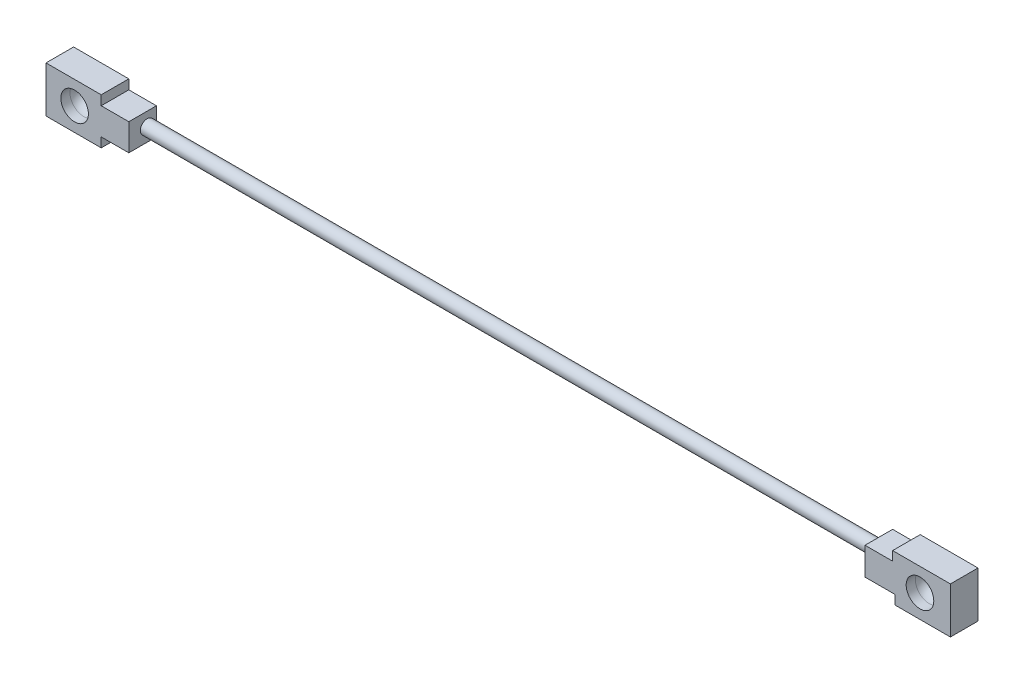
ISO-10303-21;
HEADER;
FILE_DESCRIPTION(('STEP AP214'),'2;1');
FILE_NAME('part.step','',(''),(''),'','','');
FILE_SCHEMA(('AUTOMOTIVE_DESIGN { 1 0 10303 214 1 1 1 1 }'));
ENDSEC;
DATA;
#1=APPLICATION_CONTEXT('core data for automotive mechanical design processes');
#2=APPLICATION_PROTOCOL_DEFINITION('international standard','automotive_design',2000,#1);
#3=PRODUCT_CONTEXT('',#1,'mechanical');
#4=PRODUCT('Part','Part','',(#3));
#5=PRODUCT_RELATED_PRODUCT_CATEGORY('part','',(#4));
#6=PRODUCT_DEFINITION_FORMATION('','',#4);
#7=PRODUCT_DEFINITION_CONTEXT('part definition',#1,'design');
#8=PRODUCT_DEFINITION('design','',#6,#7);
#9=PRODUCT_DEFINITION_SHAPE('','',#8);
#10=(LENGTH_UNIT() NAMED_UNIT(*) SI_UNIT(.MILLI.,.METRE.));
#11=(NAMED_UNIT(*) PLANE_ANGLE_UNIT() SI_UNIT($,.RADIAN.));
#12=(NAMED_UNIT(*) SI_UNIT($,.STERADIAN.) SOLID_ANGLE_UNIT());
#13=UNCERTAINTY_MEASURE_WITH_UNIT(LENGTH_MEASURE(1.E-05),#10,'distance_accuracy_value','');
#14=(GEOMETRIC_REPRESENTATION_CONTEXT(3) GLOBAL_UNCERTAINTY_ASSIGNED_CONTEXT((#13)) GLOBAL_UNIT_ASSIGNED_CONTEXT((#10,
#11,#12)) REPRESENTATION_CONTEXT('',''));
#15=CARTESIAN_POINT('',(0.,0.,0.));
#16=DIRECTION('',(0.,0.,1.));
#17=DIRECTION('',(1.,0.,0.));
#18=AXIS2_PLACEMENT_3D('',#15,#16,#17);
#19=CARTESIAN_POINT('',(5.89320478213972,1.46443640447974,3.));
#20=DIRECTION('',(-1.,0.,0.));
#21=DIRECTION('',(0.,0.,1.));
#22=AXIS2_PLACEMENT_3D('',#19,#20,#21);
#23=PLANE('',#22);
#24=DIRECTION('',(0.,1.,0.));
#25=VECTOR('',#24,1.);
#26=CARTESIAN_POINT('',(5.89320478213972,1.46443640447974,0.));
#27=LINE('',#26,#25);
#28=CARTESIAN_POINT('',(5.89320478213972,-1.46443640447974,0.));
#29=VERTEX_POINT('',#28);
#30=CARTESIAN_POINT('',(5.89320478213972,1.46443640447974,0.));
#31=VERTEX_POINT('',#30);
#32=EDGE_CURVE('E126',#29,#31,#27,.T.);
#33=ORIENTED_EDGE('',*,*,#32,.T.);
#34=DIRECTION('',(0.,0.,-1.));
#35=VECTOR('',#34,1.);
#36=CARTESIAN_POINT('',(5.89320478213972,1.46443640447974,3.));
#37=LINE('',#36,#35);
#38=CARTESIAN_POINT('',(5.89320478213972,1.46443640447974,3.));
#39=VERTEX_POINT('',#38);
#40=EDGE_CURVE('E123',#39,#31,#37,.T.);
#41=ORIENTED_EDGE('',*,*,#40,.F.);
#42=DIRECTION('',(0.,1.,0.));
#43=VECTOR('',#42,1.);
#44=CARTESIAN_POINT('',(5.89320478213972,1.46443640447974,3.));
#45=LINE('',#44,#43);
#46=CARTESIAN_POINT('',(5.89320478213972,-1.46443640447974,3.));
#47=VERTEX_POINT('',#46);
#48=EDGE_CURVE('E112',#47,#39,#45,.T.);
#49=ORIENTED_EDGE('',*,*,#48,.F.);
#50=DIRECTION('',(0.,0.,-1.));
#51=VECTOR('',#50,1.);
#52=CARTESIAN_POINT('',(5.89320478213972,-1.46443640447974,3.));
#53=LINE('',#52,#51);
#54=EDGE_CURVE('E127',#47,#29,#53,.T.);
#55=ORIENTED_EDGE('',*,*,#54,.T.);
#56=EDGE_LOOP('',(#33,#41,#49,#55));
#57=FACE_BOUND('',#56,.T.);
#58=CARTESIAN_POINT('',(5.89320478213971,0.,1.00000000000239));
#59=DIRECTION('',(-1.,0.,0.));
#60=DIRECTION('',(0.,0.,1.));
#61=AXIS2_PLACEMENT_3D('',#58,#59,#60);
#62=CIRCLE('',#61,0.75);
#63=CARTESIAN_POINT('',(5.89320478213971,0.,1.75000000000239));
#64=VERTEX_POINT('',#63);
#65=EDGE_CURVE('E11',#64,#64,#62,.F.);
#66=ORIENTED_EDGE('',*,*,#65,.F.);
#67=EDGE_LOOP('',(#66));
#68=FACE_BOUND('',#67,.T.);
#69=ADVANCED_FACE('F34',(#57,#68),#23,.F.);
#70=CARTESIAN_POINT('',(-3.10679521786028,2.5,3.));
#71=DIRECTION('',(0.,-1.,0.));
#72=DIRECTION('',(0.,0.,-1.));
#73=AXIS2_PLACEMENT_3D('',#70,#71,#72);
#74=PLANE('',#73);
#75=DIRECTION('',(-1.,0.,0.));
#76=VECTOR('',#75,1.);
#77=CARTESIAN_POINT('',(-3.10679521786028,2.5,0.));
#78=LINE('',#77,#76);
#79=CARTESIAN_POINT('',(2.89320478213972,2.5,0.));
#80=VERTEX_POINT('',#79);
#81=CARTESIAN_POINT('',(-3.10679521786028,2.5,0.));
#82=VERTEX_POINT('',#81);
#83=EDGE_CURVE('E136',#80,#82,#78,.T.);
#84=ORIENTED_EDGE('',*,*,#83,.T.);
#85=DIRECTION('',(0.,0.,-1.));
#86=VECTOR('',#85,1.);
#87=CARTESIAN_POINT('',(-3.10679521786028,2.5,3.));
#88=LINE('',#87,#86);
#89=CARTESIAN_POINT('',(-3.10679521786028,2.5,3.));
#90=VERTEX_POINT('',#89);
#91=EDGE_CURVE('E43',#90,#82,#88,.T.);
#92=ORIENTED_EDGE('',*,*,#91,.F.);
#93=DIRECTION('',(-1.,0.,0.));
#94=VECTOR('',#93,1.);
#95=CARTESIAN_POINT('',(-3.10679521786028,2.5,3.));
#96=LINE('',#95,#94);
#97=CARTESIAN_POINT('',(2.89320478213972,2.5,3.));
#98=VERTEX_POINT('',#97);
#99=EDGE_CURVE('E151',#98,#90,#96,.T.);
#100=ORIENTED_EDGE('',*,*,#99,.F.);
#101=DIRECTION('',(0.,0.,-1.));
#102=VECTOR('',#101,1.);
#103=CARTESIAN_POINT('',(2.89320478213972,2.5,3.));
#104=LINE('',#103,#102);
#105=EDGE_CURVE('E132',#98,#80,#104,.T.);
#106=ORIENTED_EDGE('',*,*,#105,.T.);
#107=EDGE_LOOP('',(#84,#92,#100,#106));
#108=FACE_BOUND('',#107,.T.);
#109=ADVANCED_FACE('F36',(#108),#74,.F.);
#110=CARTESIAN_POINT('',(-3.10679521786028,-2.5,3.));
#111=DIRECTION('',(1.,0.,0.));
#112=DIRECTION('',(0.,0.,-1.));
#113=AXIS2_PLACEMENT_3D('',#110,#111,#112);
#114=PLANE('',#113);
#115=DIRECTION('',(0.,-1.,0.));
#116=VECTOR('',#115,1.);
#117=CARTESIAN_POINT('',(-3.10679521786028,-2.5,0.));
#118=LINE('',#117,#116);
#119=CARTESIAN_POINT('',(-3.10679521786028,-2.5,0.));
#120=VERTEX_POINT('',#119);
#121=EDGE_CURVE('E139',#82,#120,#118,.T.);
#122=ORIENTED_EDGE('',*,*,#121,.T.);
#123=DIRECTION('',(0.,0.,-1.));
#124=VECTOR('',#123,1.);
#125=CARTESIAN_POINT('',(-3.10679521786028,-2.5,3.));
#126=LINE('',#125,#124);
#127=CARTESIAN_POINT('',(-3.10679521786028,-2.5,3.));
#128=VERTEX_POINT('',#127);
#129=EDGE_CURVE('E161',#128,#120,#126,.T.);
#130=ORIENTED_EDGE('',*,*,#129,.F.);
#131=DIRECTION('',(0.,-1.,0.));
#132=VECTOR('',#131,1.);
#133=CARTESIAN_POINT('',(-3.10679521786028,-2.5,3.));
#134=LINE('',#133,#132);
#135=EDGE_CURVE('E96',#90,#128,#134,.T.);
#136=ORIENTED_EDGE('',*,*,#135,.F.);
#137=ORIENTED_EDGE('',*,*,#91,.T.);
#138=EDGE_LOOP('',(#122,#130,#136,#137));
#139=FACE_BOUND('',#138,.T.);
#140=ADVANCED_FACE('F164',(#139),#114,.F.);
#141=CARTESIAN_POINT('',(-3.10679521786028,-2.5,3.));
#142=DIRECTION('',(0.,1.,0.));
#143=DIRECTION('',(0.,0.,1.));
#144=AXIS2_PLACEMENT_3D('',#141,#142,#143);
#145=PLANE('',#144);
#146=DIRECTION('',(1.,0.,0.));
#147=VECTOR('',#146,1.);
#148=CARTESIAN_POINT('',(-3.10679521786028,-2.5,0.));
#149=LINE('',#148,#147);
#150=CARTESIAN_POINT('',(2.89320478213972,-2.5,0.));
#151=VERTEX_POINT('',#150);
#152=EDGE_CURVE('E142',#120,#151,#149,.T.);
#153=ORIENTED_EDGE('',*,*,#152,.T.);
#154=DIRECTION('',(0.,0.,-1.));
#155=VECTOR('',#154,1.);
#156=CARTESIAN_POINT('',(2.89320478213972,-2.5,3.));
#157=LINE('',#156,#155);
#158=CARTESIAN_POINT('',(2.89320478213972,-2.5,3.));
#159=VERTEX_POINT('',#158);
#160=EDGE_CURVE('E158',#159,#151,#157,.T.);
#161=ORIENTED_EDGE('',*,*,#160,.F.);
#162=DIRECTION('',(1.,0.,0.));
#163=VECTOR('',#162,1.);
#164=CARTESIAN_POINT('',(-3.10679521786028,-2.5,3.));
#165=LINE('',#164,#163);
#166=EDGE_CURVE('E182',#128,#159,#165,.T.);
#167=ORIENTED_EDGE('',*,*,#166,.F.);
#168=ORIENTED_EDGE('',*,*,#129,.T.);
#169=EDGE_LOOP('',(#153,#161,#167,#168));
#170=FACE_BOUND('',#169,.T.);
#171=ADVANCED_FACE('F175',(#170),#145,.F.);
#172=CARTESIAN_POINT('',(2.89320478213972,-2.5,3.));
#173=DIRECTION('',(-1.,0.,0.));
#174=DIRECTION('',(0.,-1.,0.));
#175=AXIS2_PLACEMENT_3D('',#172,#173,#174);
#176=PLANE('',#175);
#177=DIRECTION('',(0.,1.,0.));
#178=VECTOR('',#177,1.);
#179=CARTESIAN_POINT('',(2.89320478213972,-2.5,0.));
#180=LINE('',#179,#178);
#181=CARTESIAN_POINT('',(2.89320478213972,-1.46443640447974,0.));
#182=VERTEX_POINT('',#181);
#183=EDGE_CURVE('E144',#151,#182,#180,.T.);
#184=ORIENTED_EDGE('',*,*,#183,.T.);
#185=DIRECTION('',(0.,0.,-1.));
#186=VECTOR('',#185,1.);
#187=CARTESIAN_POINT('',(2.89320478213972,-1.46443640447974,3.));
#188=LINE('',#187,#186);
#189=CARTESIAN_POINT('',(2.89320478213972,-1.46443640447974,3.));
#190=VERTEX_POINT('',#189);
#191=EDGE_CURVE('E155',#190,#182,#188,.T.);
#192=ORIENTED_EDGE('',*,*,#191,.F.);
#193=DIRECTION('',(0.,1.,0.));
#194=VECTOR('',#193,1.);
#195=CARTESIAN_POINT('',(2.89320478213972,-2.5,3.));
#196=LINE('',#195,#194);
#197=EDGE_CURVE('E181',#159,#190,#196,.T.);
#198=ORIENTED_EDGE('',*,*,#197,.F.);
#199=ORIENTED_EDGE('',*,*,#160,.T.);
#200=EDGE_LOOP('',(#184,#192,#198,#199));
#201=FACE_BOUND('',#200,.T.);
#202=ADVANCED_FACE('F179',(#201),#176,.F.);
#203=CARTESIAN_POINT('',(2.89320478213972,-1.46443640447974,3.));
#204=DIRECTION('',(0.,1.,0.));
#205=DIRECTION('',(0.,0.,1.));
#206=AXIS2_PLACEMENT_3D('',#203,#204,#205);
#207=PLANE('',#206);
#208=DIRECTION('',(1.,0.,0.));
#209=VECTOR('',#208,1.);
#210=CARTESIAN_POINT('',(2.89320478213972,-1.46443640447974,0.));
#211=LINE('',#210,#209);
#212=EDGE_CURVE('E146',#182,#29,#211,.T.);
#213=ORIENTED_EDGE('',*,*,#212,.T.);
#214=ORIENTED_EDGE('',*,*,#54,.F.);
#215=DIRECTION('',(1.,0.,0.));
#216=VECTOR('',#215,1.);
#217=CARTESIAN_POINT('',(2.89320478213972,-1.46443640447974,3.));
#218=LINE('',#217,#216);
#219=EDGE_CURVE('E118',#190,#47,#218,.T.);
#220=ORIENTED_EDGE('',*,*,#219,.F.);
#221=ORIENTED_EDGE('',*,*,#191,.T.);
#222=EDGE_LOOP('',(#213,#214,#220,#221));
#223=FACE_BOUND('',#222,.T.);
#224=ADVANCED_FACE('F300',(#223),#207,.F.);
#225=CARTESIAN_POINT('',(2.89320478213972,1.46443640447974,3.));
#226=DIRECTION('',(0.,-1.,0.));
#227=DIRECTION('',(0.,0.,-1.));
#228=AXIS2_PLACEMENT_3D('',#225,#226,#227);
#229=PLANE('',#228);
#230=DIRECTION('',(-1.,0.,0.));
#231=VECTOR('',#230,1.);
#232=CARTESIAN_POINT('',(2.89320478213972,1.46443640447974,0.));
#233=LINE('',#232,#231);
#234=CARTESIAN_POINT('',(2.89320478213972,1.46443640447974,0.));
#235=VERTEX_POINT('',#234);
#236=EDGE_CURVE('E81',#31,#235,#233,.T.);
#237=ORIENTED_EDGE('',*,*,#236,.T.);
#238=DIRECTION('',(0.,0.,-1.));
#239=VECTOR('',#238,1.);
#240=CARTESIAN_POINT('',(2.89320478213972,1.46443640447974,3.));
#241=LINE('',#240,#239);
#242=CARTESIAN_POINT('',(2.89320478213972,1.46443640447974,3.));
#243=VERTEX_POINT('',#242);
#244=EDGE_CURVE('E128',#243,#235,#241,.T.);
#245=ORIENTED_EDGE('',*,*,#244,.F.);
#246=DIRECTION('',(-1.,0.,0.));
#247=VECTOR('',#246,1.);
#248=CARTESIAN_POINT('',(2.89320478213972,1.46443640447974,3.));
#249=LINE('',#248,#247);
#250=EDGE_CURVE('E116',#39,#243,#249,.T.);
#251=ORIENTED_EDGE('',*,*,#250,.F.);
#252=ORIENTED_EDGE('',*,*,#40,.T.);
#253=EDGE_LOOP('',(#237,#245,#251,#252));
#254=FACE_BOUND('',#253,.T.);
#255=ADVANCED_FACE('F130',(#254),#229,.F.);
#256=CARTESIAN_POINT('',(2.89320478213972,2.5,3.));
#257=DIRECTION('',(-1.,0.,0.));
#258=DIRECTION('',(0.,-1.,0.));
#259=AXIS2_PLACEMENT_3D('',#256,#257,#258);
#260=PLANE('',#259);
#261=DIRECTION('',(0.,1.,0.));
#262=VECTOR('',#261,1.);
#263=CARTESIAN_POINT('',(2.89320478213972,2.5,0.));
#264=LINE('',#263,#262);
#265=EDGE_CURVE('E87',#235,#80,#264,.T.);
#266=ORIENTED_EDGE('',*,*,#265,.T.);
#267=ORIENTED_EDGE('',*,*,#105,.F.);
#268=DIRECTION('',(0.,1.,0.));
#269=VECTOR('',#268,1.);
#270=CARTESIAN_POINT('',(2.89320478213972,2.5,3.));
#271=LINE('',#270,#269);
#272=EDGE_CURVE('E51',#243,#98,#271,.T.);
#273=ORIENTED_EDGE('',*,*,#272,.F.);
#274=ORIENTED_EDGE('',*,*,#244,.T.);
#275=EDGE_LOOP('',(#266,#267,#273,#274));
#276=FACE_BOUND('',#275,.T.);
#277=ADVANCED_FACE('F285',(#276),#260,.F.);
#278=CARTESIAN_POINT('',(2.89320478213972,2.5,3.));
#279=DIRECTION('',(0.,0.,-1.));
#280=DIRECTION('',(-1.,0.,0.));
#281=AXIS2_PLACEMENT_3D('',#278,#279,#280);
#282=PLANE('',#281);
#283=CARTESIAN_POINT('',(0.,0.,3.));
#284=DIRECTION('',(0.,0.,1.));
#285=DIRECTION('',(1.,0.,0.));
#286=AXIS2_PLACEMENT_3D('',#283,#284,#285);
#287=CIRCLE('',#286,1.5);
#288=CARTESIAN_POINT('',(1.5,0.,3.));
#289=VERTEX_POINT('',#288);
#290=EDGE_CURVE('E140',#289,#289,#287,.T.);
#291=ORIENTED_EDGE('',*,*,#290,.F.);
#292=EDGE_LOOP('',(#291));
#293=FACE_BOUND('',#292,.T.);
#294=ORIENTED_EDGE('',*,*,#99,.T.);
#295=ORIENTED_EDGE('',*,*,#135,.T.);
#296=ORIENTED_EDGE('',*,*,#166,.T.);
#297=ORIENTED_EDGE('',*,*,#197,.T.);
#298=ORIENTED_EDGE('',*,*,#219,.T.);
#299=ORIENTED_EDGE('',*,*,#48,.T.);
#300=ORIENTED_EDGE('',*,*,#250,.T.);
#301=ORIENTED_EDGE('',*,*,#272,.T.);
#302=EDGE_LOOP('',(#294,#295,#296,#297,#298,#299,#300,#301));
#303=FACE_BOUND('',#302,.T.);
#304=ADVANCED_FACE('F114',(#293,#303),#282,.F.);
#305=CARTESIAN_POINT('',(2.89320478213972,2.5,0.));
#306=DIRECTION('',(0.,0.,-1.));
#307=DIRECTION('',(-1.,0.,0.));
#308=AXIS2_PLACEMENT_3D('',#305,#306,#307);
#309=PLANE('',#308);
#310=ORIENTED_EDGE('',*,*,#83,.F.);
#311=ORIENTED_EDGE('',*,*,#265,.F.);
#312=ORIENTED_EDGE('',*,*,#236,.F.);
#313=ORIENTED_EDGE('',*,*,#32,.F.);
#314=ORIENTED_EDGE('',*,*,#212,.F.);
#315=ORIENTED_EDGE('',*,*,#183,.F.);
#316=ORIENTED_EDGE('',*,*,#152,.F.);
#317=ORIENTED_EDGE('',*,*,#121,.F.);
#318=EDGE_LOOP('',(#310,#311,#312,#313,#314,#315,#316,#317));
#319=FACE_BOUND('',#318,.T.);
#320=ADVANCED_FACE('F169',(#319),#309,.T.);
#321=CARTESIAN_POINT('',(0.,0.,2.));
#322=DIRECTION('',(0.,0.,1.));
#323=DIRECTION('',(1.,0.,0.));
#324=AXIS2_PLACEMENT_3D('',#321,#322,#323);
#325=CYLINDRICAL_SURFACE('',#324,1.5);
#326=CARTESIAN_POINT('',(0.,0.,2.));
#327=DIRECTION('',(0.,0.,1.));
#328=DIRECTION('',(1.,0.,0.));
#329=AXIS2_PLACEMENT_3D('',#326,#327,#328);
#330=CIRCLE('',#329,1.5);
#331=CARTESIAN_POINT('',(1.5,0.,2.));
#332=VERTEX_POINT('',#331);
#333=EDGE_CURVE('E271',#332,#332,#330,.T.);
#334=ORIENTED_EDGE('',*,*,#333,.F.);
#335=EDGE_LOOP('',(#334));
#336=FACE_BOUND('',#335,.T.);
#337=ORIENTED_EDGE('',*,*,#290,.T.);
#338=EDGE_LOOP('',(#337));
#339=FACE_BOUND('',#338,.T.);
#340=ADVANCED_FACE('F277',(#336,#339),#325,.F.);
#341=CARTESIAN_POINT('',(85.8932047821397,0.,1.00000000000239));
#342=DIRECTION('',(-1.,0.,0.));
#343=DIRECTION('',(0.,0.,1.));
#344=AXIS2_PLACEMENT_3D('',#341,#342,#343);
#345=CYLINDRICAL_SURFACE('',#344,0.75);
#346=CARTESIAN_POINT('',(85.8932047821397,0.,1.00000000000239));
#347=DIRECTION('',(1.,0.,0.));
#348=DIRECTION('',(0.,0.,-1.));
#349=AXIS2_PLACEMENT_3D('',#346,#347,#348);
#350=CIRCLE('',#349,0.75);
#351=CARTESIAN_POINT('',(85.8932047821397,0.,0.250000000002387));
#352=VERTEX_POINT('',#351);
#353=EDGE_CURVE('E190',#352,#352,#350,.T.);
#354=ORIENTED_EDGE('',*,*,#353,.F.);
#355=EDGE_LOOP('',(#354));
#356=FACE_BOUND('',#355,.T.);
#357=ORIENTED_EDGE('',*,*,#65,.T.);
#358=EDGE_LOOP('',(#357));
#359=FACE_BOUND('',#358,.T.);
#360=ADVANCED_FACE('F280',(#356,#359),#345,.T.);
#361=CARTESIAN_POINT('',(85.8932047821397,0.75,3.));
#362=DIRECTION('',(-1.,0.,0.));
#363=DIRECTION('',(0.,0.,1.));
#364=AXIS2_PLACEMENT_3D('',#361,#362,#363);
#365=PLANE('',#364);
#366=DIRECTION('',(0.,1.,0.));
#367=VECTOR('',#366,1.);
#368=CARTESIAN_POINT('',(85.8932047821397,0.75,0.));
#369=LINE('',#368,#367);
#370=CARTESIAN_POINT('',(85.8932047821397,-1.3931183815572,0.));
#371=VERTEX_POINT('',#370);
#372=CARTESIAN_POINT('',(85.8932047821397,1.6068816184428,0.));
#373=VERTEX_POINT('',#372);
#374=EDGE_CURVE('E240',#371,#373,#369,.T.);
#375=ORIENTED_EDGE('',*,*,#374,.F.);
#376=DIRECTION('',(0.,0.,-1.));
#377=VECTOR('',#376,1.);
#378=CARTESIAN_POINT('',(85.8932047821397,-1.3931183815572,3.));
#379=LINE('',#378,#377);
#380=CARTESIAN_POINT('',(85.8932047821397,-1.3931183815572,3.));
#381=VERTEX_POINT('',#380);
#382=EDGE_CURVE('E193',#381,#371,#379,.T.);
#383=ORIENTED_EDGE('',*,*,#382,.F.);
#384=DIRECTION('',(0.,1.,0.));
#385=VECTOR('',#384,1.);
#386=CARTESIAN_POINT('',(85.8932047821397,-1.3931183815572,3.));
#387=LINE('',#386,#385);
#388=CARTESIAN_POINT('',(85.8932047821397,1.6068816184428,3.));
#389=VERTEX_POINT('',#388);
#390=EDGE_CURVE('E221',#381,#389,#387,.T.);
#391=ORIENTED_EDGE('',*,*,#390,.T.);
#392=DIRECTION('',(0.,0.,-1.));
#393=VECTOR('',#392,1.);
#394=CARTESIAN_POINT('',(85.8932047821397,1.6068816184428,3.));
#395=LINE('',#394,#393);
#396=EDGE_CURVE('E194',#389,#373,#395,.T.);
#397=ORIENTED_EDGE('',*,*,#396,.T.);
#398=EDGE_LOOP('',(#375,#383,#391,#397));
#399=FACE_BOUND('',#398,.T.);
#400=ORIENTED_EDGE('',*,*,#353,.T.);
#401=EDGE_LOOP('',(#400));
#402=FACE_BOUND('',#401,.T.);
#403=ADVANCED_FACE('F362',(#399,#402),#365,.T.);
#404=CARTESIAN_POINT('',(89.1708915265694,-1.3931183815572,3.));
#405=DIRECTION('',(0.,-1.,0.));
#406=DIRECTION('',(1.,0.,0.));
#407=AXIS2_PLACEMENT_3D('',#404,#405,#406);
#408=PLANE('',#407);
#409=DIRECTION('',(-1.,0.,0.));
#410=VECTOR('',#409,1.);
#411=CARTESIAN_POINT('',(89.1708915265694,-1.3931183815572,0.));
#412=LINE('',#411,#410);
#413=CARTESIAN_POINT('',(89.1708915265694,-1.3931183815572,0.));
#414=VERTEX_POINT('',#413);
#415=EDGE_CURVE('E218',#414,#371,#412,.T.);
#416=ORIENTED_EDGE('',*,*,#415,.F.);
#417=DIRECTION('',(0.,0.,-1.));
#418=VECTOR('',#417,1.);
#419=CARTESIAN_POINT('',(89.1708915265694,-1.3931183815572,3.));
#420=LINE('',#419,#418);
#421=CARTESIAN_POINT('',(89.1708915265694,-1.3931183815572,3.));
#422=VERTEX_POINT('',#421);
#423=EDGE_CURVE('E213',#422,#414,#420,.T.);
#424=ORIENTED_EDGE('',*,*,#423,.F.);
#425=DIRECTION('',(-1.,0.,0.));
#426=VECTOR('',#425,1.);
#427=CARTESIAN_POINT('',(89.1708915265694,-1.3931183815572,3.));
#428=LINE('',#427,#426);
#429=EDGE_CURVE('E198',#422,#381,#428,.T.);
#430=ORIENTED_EDGE('',*,*,#429,.T.);
#431=ORIENTED_EDGE('',*,*,#382,.T.);
#432=EDGE_LOOP('',(#416,#424,#430,#431));
#433=FACE_BOUND('',#432,.T.);
#434=ADVANCED_FACE('F373',(#433),#408,.T.);
#435=CARTESIAN_POINT('',(89.1708915265694,-2.3931183815572,3.));
#436=DIRECTION('',(-1.,0.,0.));
#437=DIRECTION('',(0.,0.,1.));
#438=AXIS2_PLACEMENT_3D('',#435,#436,#437);
#439=PLANE('',#438);
#440=DIRECTION('',(0.,1.,0.));
#441=VECTOR('',#440,1.);
#442=CARTESIAN_POINT('',(89.1708915265694,-2.3931183815572,0.));
#443=LINE('',#442,#441);
#444=CARTESIAN_POINT('',(89.1708915265694,-2.3931183815572,0.));
#445=VERTEX_POINT('',#444);
#446=EDGE_CURVE('E222',#445,#414,#443,.T.);
#447=ORIENTED_EDGE('',*,*,#446,.F.);
#448=DIRECTION('',(0.,0.,-1.));
#449=VECTOR('',#448,1.);
#450=CARTESIAN_POINT('',(89.1708915265694,-2.3931183815572,3.));
#451=LINE('',#450,#449);
#452=CARTESIAN_POINT('',(89.1708915265694,-2.3931183815572,3.));
#453=VERTEX_POINT('',#452);
#454=EDGE_CURVE('E210',#453,#445,#451,.T.);
#455=ORIENTED_EDGE('',*,*,#454,.F.);
#456=DIRECTION('',(0.,1.,0.));
#457=VECTOR('',#456,1.);
#458=CARTESIAN_POINT('',(89.1708915265694,-2.3931183815572,3.));
#459=LINE('',#458,#457);
#460=EDGE_CURVE('E246',#453,#422,#459,.T.);
#461=ORIENTED_EDGE('',*,*,#460,.T.);
#462=ORIENTED_EDGE('',*,*,#423,.T.);
#463=EDGE_LOOP('',(#447,#455,#461,#462));
#464=FACE_BOUND('',#463,.T.);
#465=ADVANCED_FACE('F384',(#464),#439,.T.);
#466=CARTESIAN_POINT('',(95.1708915265694,-2.3931183815572,3.));
#467=DIRECTION('',(0.,-1.,0.));
#468=DIRECTION('',(1.,0.,0.));
#469=AXIS2_PLACEMENT_3D('',#466,#467,#468);
#470=PLANE('',#469);
#471=DIRECTION('',(-1.,0.,0.));
#472=VECTOR('',#471,1.);
#473=CARTESIAN_POINT('',(95.1708915265694,-2.3931183815572,0.));
#474=LINE('',#473,#472);
#475=CARTESIAN_POINT('',(95.1708915265694,-2.3931183815572,0.));
#476=VERTEX_POINT('',#475);
#477=EDGE_CURVE('E225',#476,#445,#474,.T.);
#478=ORIENTED_EDGE('',*,*,#477,.F.);
#479=DIRECTION('',(0.,0.,-1.));
#480=VECTOR('',#479,1.);
#481=CARTESIAN_POINT('',(95.1708915265694,-2.3931183815572,3.));
#482=LINE('',#481,#480);
#483=CARTESIAN_POINT('',(95.1708915265694,-2.3931183815572,3.));
#484=VERTEX_POINT('',#483);
#485=EDGE_CURVE('E207',#484,#476,#482,.T.);
#486=ORIENTED_EDGE('',*,*,#485,.F.);
#487=DIRECTION('',(-1.,0.,0.));
#488=VECTOR('',#487,1.);
#489=CARTESIAN_POINT('',(95.1708915265694,-2.3931183815572,3.));
#490=LINE('',#489,#488);
#491=EDGE_CURVE('E249',#484,#453,#490,.T.);
#492=ORIENTED_EDGE('',*,*,#491,.T.);
#493=ORIENTED_EDGE('',*,*,#454,.T.);
#494=EDGE_LOOP('',(#478,#486,#492,#493));
#495=FACE_BOUND('',#494,.T.);
#496=ADVANCED_FACE('F394',(#495),#470,.T.);
#497=CARTESIAN_POINT('',(95.1708915265694,2.6068816184428,3.));
#498=DIRECTION('',(1.,0.,0.));
#499=DIRECTION('',(0.,0.,-1.));
#500=AXIS2_PLACEMENT_3D('',#497,#498,#499);
#501=PLANE('',#500);
#502=DIRECTION('',(0.,-1.,0.));
#503=VECTOR('',#502,1.);
#504=CARTESIAN_POINT('',(95.1708915265694,2.6068816184428,0.));
#505=LINE('',#504,#503);
#506=CARTESIAN_POINT('',(95.1708915265694,2.6068816184428,0.));
#507=VERTEX_POINT('',#506);
#508=EDGE_CURVE('E228',#507,#476,#505,.T.);
#509=ORIENTED_EDGE('',*,*,#508,.F.);
#510=DIRECTION('',(0.,0.,-1.));
#511=VECTOR('',#510,1.);
#512=CARTESIAN_POINT('',(95.1708915265694,2.6068816184428,3.));
#513=LINE('',#512,#511);
#514=CARTESIAN_POINT('',(95.1708915265694,2.6068816184428,3.));
#515=VERTEX_POINT('',#514);
#516=EDGE_CURVE('E204',#515,#507,#513,.T.);
#517=ORIENTED_EDGE('',*,*,#516,.F.);
#518=DIRECTION('',(0.,-1.,0.));
#519=VECTOR('',#518,1.);
#520=CARTESIAN_POINT('',(95.1708915265694,2.6068816184428,3.));
#521=LINE('',#520,#519);
#522=EDGE_CURVE('E252',#515,#484,#521,.T.);
#523=ORIENTED_EDGE('',*,*,#522,.T.);
#524=ORIENTED_EDGE('',*,*,#485,.T.);
#525=EDGE_LOOP('',(#509,#517,#523,#524));
#526=FACE_BOUND('',#525,.T.);
#527=ADVANCED_FACE('F404',(#526),#501,.T.);
#528=CARTESIAN_POINT('',(88.8932047821397,2.6068816184428,3.));
#529=DIRECTION('',(0.,1.,0.));
#530=DIRECTION('',(0.,0.,1.));
#531=AXIS2_PLACEMENT_3D('',#528,#529,#530);
#532=PLANE('',#531);
#533=DIRECTION('',(1.,0.,0.));
#534=VECTOR('',#533,1.);
#535=CARTESIAN_POINT('',(88.8932047821397,2.6068816184428,0.));
#536=LINE('',#535,#534);
#537=CARTESIAN_POINT('',(88.8932047821397,2.6068816184428,0.));
#538=VERTEX_POINT('',#537);
#539=EDGE_CURVE('E231',#538,#507,#536,.T.);
#540=ORIENTED_EDGE('',*,*,#539,.F.);
#541=DIRECTION('',(0.,0.,-1.));
#542=VECTOR('',#541,1.);
#543=CARTESIAN_POINT('',(88.8932047821397,2.6068816184428,3.));
#544=LINE('',#543,#542);
#545=CARTESIAN_POINT('',(88.8932047821397,2.6068816184428,3.));
#546=VERTEX_POINT('',#545);
#547=EDGE_CURVE('E201',#546,#538,#544,.T.);
#548=ORIENTED_EDGE('',*,*,#547,.F.);
#549=DIRECTION('',(1.,0.,0.));
#550=VECTOR('',#549,1.);
#551=CARTESIAN_POINT('',(88.8932047821397,2.6068816184428,3.));
#552=LINE('',#551,#550);
#553=EDGE_CURVE('E255',#546,#515,#552,.T.);
#554=ORIENTED_EDGE('',*,*,#553,.T.);
#555=ORIENTED_EDGE('',*,*,#516,.T.);
#556=EDGE_LOOP('',(#540,#548,#554,#555));
#557=FACE_BOUND('',#556,.T.);
#558=ADVANCED_FACE('F414',(#557),#532,.T.);
#559=CARTESIAN_POINT('',(88.8932047821397,1.6068816184428,3.));
#560=DIRECTION('',(-1.,0.,0.));
#561=DIRECTION('',(0.,0.,1.));
#562=AXIS2_PLACEMENT_3D('',#559,#560,#561);
#563=PLANE('',#562);
#564=DIRECTION('',(0.,1.,0.));
#565=VECTOR('',#564,1.);
#566=CARTESIAN_POINT('',(88.8932047821397,1.6068816184428,0.));
#567=LINE('',#566,#565);
#568=CARTESIAN_POINT('',(88.8932047821397,1.6068816184428,0.));
#569=VERTEX_POINT('',#568);
#570=EDGE_CURVE('E234',#569,#538,#567,.T.);
#571=ORIENTED_EDGE('',*,*,#570,.F.);
#572=DIRECTION('',(0.,0.,-1.));
#573=VECTOR('',#572,1.);
#574=CARTESIAN_POINT('',(88.8932047821397,1.6068816184428,3.));
#575=LINE('',#574,#573);
#576=CARTESIAN_POINT('',(88.8932047821397,1.6068816184428,3.));
#577=VERTEX_POINT('',#576);
#578=EDGE_CURVE('E197',#577,#569,#575,.T.);
#579=ORIENTED_EDGE('',*,*,#578,.F.);
#580=DIRECTION('',(0.,1.,0.));
#581=VECTOR('',#580,1.);
#582=CARTESIAN_POINT('',(88.8932047821397,1.6068816184428,3.));
#583=LINE('',#582,#581);
#584=EDGE_CURVE('E258',#577,#546,#583,.T.);
#585=ORIENTED_EDGE('',*,*,#584,.T.);
#586=ORIENTED_EDGE('',*,*,#547,.T.);
#587=EDGE_LOOP('',(#571,#579,#585,#586));
#588=FACE_BOUND('',#587,.T.);
#589=ADVANCED_FACE('F424',(#588),#563,.T.);
#590=CARTESIAN_POINT('',(85.8932047821397,1.6068816184428,3.));
#591=DIRECTION('',(0.,1.,0.));
#592=DIRECTION('',(0.,0.,1.));
#593=AXIS2_PLACEMENT_3D('',#590,#591,#592);
#594=PLANE('',#593);
#595=DIRECTION('',(1.,0.,0.));
#596=VECTOR('',#595,1.);
#597=CARTESIAN_POINT('',(85.8932047821397,1.6068816184428,0.));
#598=LINE('',#597,#596);
#599=EDGE_CURVE('E237',#373,#569,#598,.T.);
#600=ORIENTED_EDGE('',*,*,#599,.F.);
#601=ORIENTED_EDGE('',*,*,#396,.F.);
#602=DIRECTION('',(1.,0.,0.));
#603=VECTOR('',#602,1.);
#604=CARTESIAN_POINT('',(85.8932047821397,1.6068816184428,3.));
#605=LINE('',#604,#603);
#606=EDGE_CURVE('E261',#389,#577,#605,.T.);
#607=ORIENTED_EDGE('',*,*,#606,.T.);
#608=ORIENTED_EDGE('',*,*,#578,.T.);
#609=EDGE_LOOP('',(#600,#601,#607,#608));
#610=FACE_BOUND('',#609,.T.);
#611=ADVANCED_FACE('F434',(#610),#594,.T.);
#612=CARTESIAN_POINT('',(85.8932047821397,1.6068816184428,3.));
#613=DIRECTION('',(0.,0.,-1.));
#614=DIRECTION('',(-1.,0.,0.));
#615=AXIS2_PLACEMENT_3D('',#612,#613,#614);
#616=PLANE('',#615);
#617=CARTESIAN_POINT('',(91.8655521774163,0.106881618446381,3.));
#618=DIRECTION('',(0.,0.,1.));
#619=DIRECTION('',(1.,0.,0.));
#620=AXIS2_PLACEMENT_3D('',#617,#618,#619);
#621=CIRCLE('',#620,1.5);
#622=CARTESIAN_POINT('',(93.3655521774163,0.106881618446381,3.));
#623=VERTEX_POINT('',#622);
#624=EDGE_CURVE('E243',#623,#623,#621,.T.);
#625=ORIENTED_EDGE('',*,*,#624,.F.);
#626=EDGE_LOOP('',(#625));
#627=FACE_BOUND('',#626,.T.);
#628=ORIENTED_EDGE('',*,*,#390,.F.);
#629=ORIENTED_EDGE('',*,*,#429,.F.);
#630=ORIENTED_EDGE('',*,*,#460,.F.);
#631=ORIENTED_EDGE('',*,*,#491,.F.);
#632=ORIENTED_EDGE('',*,*,#522,.F.);
#633=ORIENTED_EDGE('',*,*,#553,.F.);
#634=ORIENTED_EDGE('',*,*,#584,.F.);
#635=ORIENTED_EDGE('',*,*,#606,.F.);
#636=EDGE_LOOP('',(#628,#629,#630,#631,#632,#633,#634,#635));
#637=FACE_BOUND('',#636,.T.);
#638=ADVANCED_FACE('F444',(#627,#637),#616,.F.);
#639=CARTESIAN_POINT('',(85.8932047821397,1.6068816184428,0.));
#640=DIRECTION('',(0.,0.,-1.));
#641=DIRECTION('',(-1.,0.,0.));
#642=AXIS2_PLACEMENT_3D('',#639,#640,#641);
#643=PLANE('',#642);
#644=ORIENTED_EDGE('',*,*,#415,.T.);
#645=ORIENTED_EDGE('',*,*,#374,.T.);
#646=ORIENTED_EDGE('',*,*,#599,.T.);
#647=ORIENTED_EDGE('',*,*,#570,.T.);
#648=ORIENTED_EDGE('',*,*,#539,.T.);
#649=ORIENTED_EDGE('',*,*,#508,.T.);
#650=ORIENTED_EDGE('',*,*,#477,.T.);
#651=ORIENTED_EDGE('',*,*,#446,.T.);
#652=EDGE_LOOP('',(#644,#645,#646,#647,#648,#649,#650,#651));
#653=FACE_BOUND('',#652,.T.);
#654=ADVANCED_FACE('F452',(#653),#643,.T.);
#655=CARTESIAN_POINT('',(91.8655521774163,0.106881618446381,2.));
#656=DIRECTION('',(0.,0.,1.));
#657=DIRECTION('',(1.,0.,0.));
#658=AXIS2_PLACEMENT_3D('',#655,#656,#657);
#659=CYLINDRICAL_SURFACE('',#658,1.5);
#660=CARTESIAN_POINT('',(91.8655521774163,0.106881618446381,2.));
#661=DIRECTION('',(0.,0.,1.));
#662=DIRECTION('',(1.,0.,0.));
#663=AXIS2_PLACEMENT_3D('',#660,#661,#662);
#664=CIRCLE('',#663,1.5);
#665=CARTESIAN_POINT('',(93.3655521774163,0.106881618446381,2.));
#666=VERTEX_POINT('',#665);
#667=EDGE_CURVE('E268',#666,#666,#664,.T.);
#668=ORIENTED_EDGE('',*,*,#667,.F.);
#669=EDGE_LOOP('',(#668));
#670=FACE_BOUND('',#669,.T.);
#671=ORIENTED_EDGE('',*,*,#624,.T.);
#672=EDGE_LOOP('',(#671));
#673=FACE_BOUND('',#672,.T.);
#674=ADVANCED_FACE('F457',(#670,#673),#659,.F.);
#675=CARTESIAN_POINT('',(91.8655521774163,0.106881618446381,2.));
#676=DIRECTION('',(0.,-1.,0.));
#677=DIRECTION('',(-1.,0.,0.));
#678=AXIS2_PLACEMENT_3D('',#675,#676,#677);
#679=SPHERICAL_SURFACE('',#678,1.5);
#680=CARTESIAN_POINT('',(91.8655521774163,0.106881618446381,2.));
#681=DIRECTION('',(0.,0.,1.));
#682=DIRECTION('',(1.,0.,0.));
#683=AXIS2_PLACEMENT_3D('',#680,#681,#682);
#684=SPHERICAL_SURFACE('',#683,1.5);
#685=ORIENTED_EDGE('',*,*,#667,.T.);
#686=EDGE_LOOP('',(#685));
#687=FACE_BOUND('',#686,.T.);
#688=ADVANCED_FACE('F474',(#687),#684,.F.);
#689=CARTESIAN_POINT('',(0.,0.,2.));
#690=DIRECTION('',(0.,-1.,0.));
#691=DIRECTION('',(-1.,0.,0.));
#692=AXIS2_PLACEMENT_3D('',#689,#690,#691);
#693=SPHERICAL_SURFACE('',#692,1.5);
#694=CARTESIAN_POINT('',(0.,0.,2.));
#695=DIRECTION('',(0.,0.,1.));
#696=DIRECTION('',(1.,0.,0.));
#697=AXIS2_PLACEMENT_3D('',#694,#695,#696);
#698=SPHERICAL_SURFACE('',#697,1.5);
#699=ORIENTED_EDGE('',*,*,#333,.T.);
#700=EDGE_LOOP('',(#699));
#701=FACE_BOUND('',#700,.T.);
#702=ADVANCED_FACE('F275',(#701),#698,.F.);
#703=CLOSED_SHELL('',(#69,#109,#140,#171,#202,#224,#255,#277,#304,#320,#340,#360,#403,#434,#465,
#496,#527,#558,#589,#611,#638,#654,#674,#688,#702));
#704=MANIFOLD_SOLID_BREP('B2',#703);
#705=ADVANCED_BREP_SHAPE_REPRESENTATION('',(#18,#704),#14);
#706=SHAPE_DEFINITION_REPRESENTATION(#9,#705);
ENDSEC;
END-ISO-10303-21;
